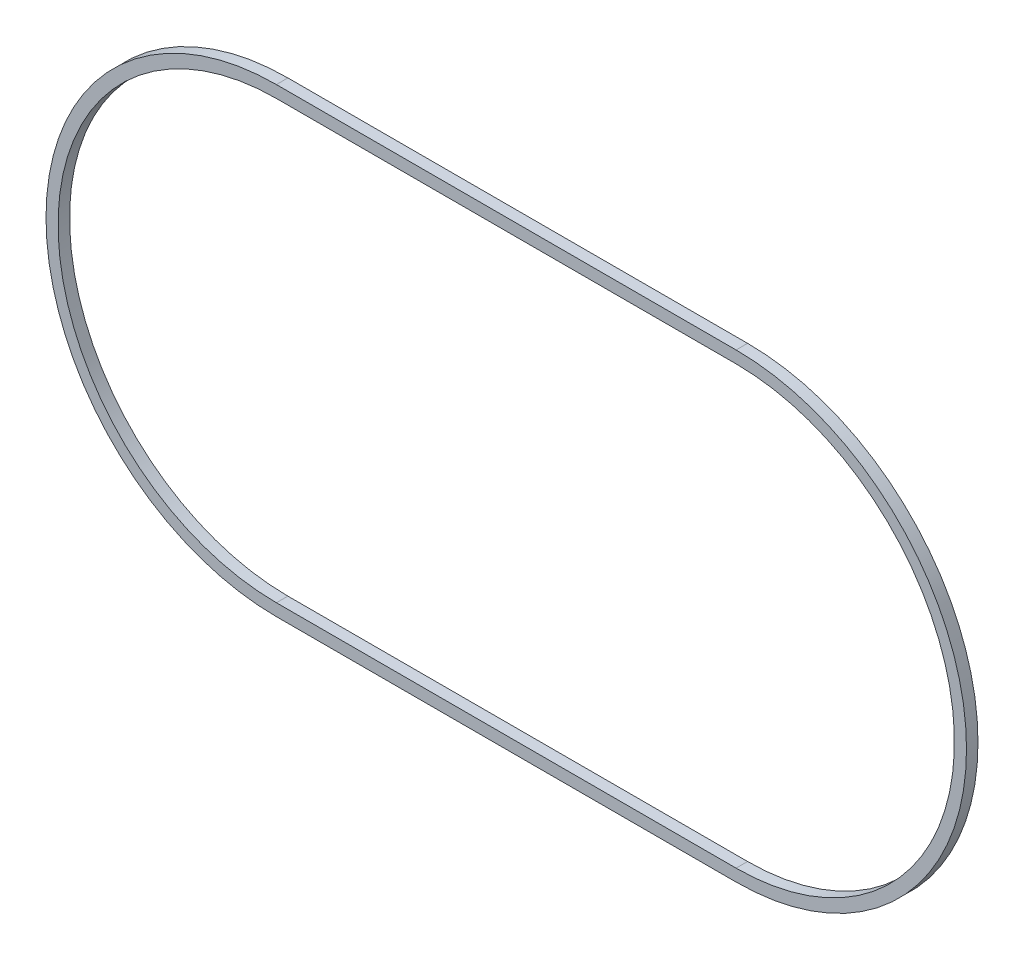
ISO-10303-21;
HEADER;
FILE_DESCRIPTION(('STEP AP214'),'2;1');
FILE_NAME('part.step','',(''),(''),'','','');
FILE_SCHEMA(('AUTOMOTIVE_DESIGN { 1 0 10303 214 1 1 1 1 }'));
ENDSEC;
DATA;
#1=APPLICATION_CONTEXT('core data for automotive mechanical design processes');
#2=APPLICATION_PROTOCOL_DEFINITION('international standard','automotive_design',2000,#1);
#3=PRODUCT_CONTEXT('',#1,'mechanical');
#4=PRODUCT('Part','Part','',(#3));
#5=PRODUCT_RELATED_PRODUCT_CATEGORY('part','',(#4));
#6=PRODUCT_DEFINITION_FORMATION('','',#4);
#7=PRODUCT_DEFINITION_CONTEXT('part definition',#1,'design');
#8=PRODUCT_DEFINITION('design','',#6,#7);
#9=PRODUCT_DEFINITION_SHAPE('','',#8);
#10=(LENGTH_UNIT() NAMED_UNIT(*) SI_UNIT(.MILLI.,.METRE.));
#11=(NAMED_UNIT(*) PLANE_ANGLE_UNIT() SI_UNIT($,.RADIAN.));
#12=(NAMED_UNIT(*) SI_UNIT($,.STERADIAN.) SOLID_ANGLE_UNIT());
#13=UNCERTAINTY_MEASURE_WITH_UNIT(LENGTH_MEASURE(1.E-05),#10,'distance_accuracy_value','');
#14=(GEOMETRIC_REPRESENTATION_CONTEXT(3) GLOBAL_UNCERTAINTY_ASSIGNED_CONTEXT((#13)) GLOBAL_UNIT_ASSIGNED_CONTEXT((#10,
#11,#12)) REPRESENTATION_CONTEXT('',''));
#15=CARTESIAN_POINT('',(0.,0.,0.));
#16=DIRECTION('',(0.,0.,1.));
#17=DIRECTION('',(1.,0.,0.));
#18=AXIS2_PLACEMENT_3D('',#15,#16,#17);
#19=CARTESIAN_POINT('',(-40.,0.,2.));
#20=DIRECTION('',(0.,0.,1.));
#21=DIRECTION('',(1.,0.,0.));
#22=AXIS2_PLACEMENT_3D('',#19,#20,#21);
#23=PLANE('',#22);
#24=CARTESIAN_POINT('',(-40.,0.,2.));
#25=DIRECTION('',(0.,0.,1.));
#26=DIRECTION('',(1.,0.,0.));
#27=AXIS2_PLACEMENT_3D('',#24,#25,#26);
#28=CIRCLE('',#27,40.1);
#29=CARTESIAN_POINT('',(-40.,40.1,2.));
#30=VERTEX_POINT('',#29);
#31=CARTESIAN_POINT('',(-40.,-40.1,2.));
#32=VERTEX_POINT('',#31);
#33=EDGE_CURVE('E140',#30,#32,#28,.T.);
#34=ORIENTED_EDGE('',*,*,#33,.T.);
#35=DIRECTION('',(1.,0.,0.));
#36=VECTOR('',#35,1.);
#37=CARTESIAN_POINT('',(-40.,-40.1,2.));
#38=LINE('',#37,#36);
#39=CARTESIAN_POINT('',(40.,-40.1,2.));
#40=VERTEX_POINT('',#39);
#41=EDGE_CURVE('E143',#32,#40,#38,.T.);
#42=ORIENTED_EDGE('',*,*,#41,.T.);
#43=CARTESIAN_POINT('',(40.,0.,2.));
#44=DIRECTION('',(0.,0.,1.));
#45=DIRECTION('',(1.,0.,0.));
#46=AXIS2_PLACEMENT_3D('',#43,#44,#45);
#47=CIRCLE('',#46,40.1);
#48=CARTESIAN_POINT('',(40.,40.1,2.));
#49=VERTEX_POINT('',#48);
#50=EDGE_CURVE('E146',#40,#49,#47,.T.);
#51=ORIENTED_EDGE('',*,*,#50,.T.);
#52=DIRECTION('',(-1.,0.,0.));
#53=VECTOR('',#52,1.);
#54=CARTESIAN_POINT('',(-40.,40.1,2.));
#55=LINE('',#54,#53);
#56=EDGE_CURVE('E148',#49,#30,#55,.T.);
#57=ORIENTED_EDGE('',*,*,#56,.T.);
#58=EDGE_LOOP('',(#34,#42,#51,#57));
#59=FACE_BOUND('',#58,.T.);
#60=DIRECTION('',(1.,0.,0.));
#61=VECTOR('',#60,1.);
#62=CARTESIAN_POINT('',(-40.,-38.,2.));
#63=LINE('',#62,#61);
#64=CARTESIAN_POINT('',(-40.,-38.,2.));
#65=VERTEX_POINT('',#64);
#66=CARTESIAN_POINT('',(40.,-38.,2.));
#67=VERTEX_POINT('',#66);
#68=EDGE_CURVE('E112',#65,#67,#63,.T.);
#69=ORIENTED_EDGE('',*,*,#68,.F.);
#70=CARTESIAN_POINT('',(-40.,0.,2.));
#71=DIRECTION('',(0.,0.,1.));
#72=DIRECTION('',(1.,0.,0.));
#73=AXIS2_PLACEMENT_3D('',#70,#71,#72);
#74=CIRCLE('',#73,38.);
#75=CARTESIAN_POINT('',(-40.,38.,2.));
#76=VERTEX_POINT('',#75);
#77=EDGE_CURVE('E104',#76,#65,#74,.T.);
#78=ORIENTED_EDGE('',*,*,#77,.F.);
#79=DIRECTION('',(-1.,0.,0.));
#80=VECTOR('',#79,1.);
#81=CARTESIAN_POINT('',(-40.,38.,2.));
#82=LINE('',#81,#80);
#83=CARTESIAN_POINT('',(40.,38.,2.));
#84=VERTEX_POINT('',#83);
#85=EDGE_CURVE('E126',#84,#76,#82,.T.);
#86=ORIENTED_EDGE('',*,*,#85,.F.);
#87=CARTESIAN_POINT('',(40.,0.,2.));
#88=DIRECTION('',(0.,0.,1.));
#89=DIRECTION('',(1.,0.,0.));
#90=AXIS2_PLACEMENT_3D('',#87,#88,#89);
#91=CIRCLE('',#90,38.);
#92=EDGE_CURVE('E124',#67,#84,#91,.T.);
#93=ORIENTED_EDGE('',*,*,#92,.F.);
#94=EDGE_LOOP('',(#69,#78,#86,#93));
#95=FACE_BOUND('',#94,.T.);
#96=ADVANCED_FACE('F39',(#59,#95),#23,.T.);
#97=CARTESIAN_POINT('',(-40.,0.,0.));
#98=DIRECTION('',(0.,0.,1.));
#99=DIRECTION('',(1.,0.,0.));
#100=AXIS2_PLACEMENT_3D('',#97,#98,#99);
#101=PLANE('',#100);
#102=CARTESIAN_POINT('',(-40.,0.,0.));
#103=DIRECTION('',(0.,0.,1.));
#104=DIRECTION('',(1.,0.,0.));
#105=AXIS2_PLACEMENT_3D('',#102,#103,#104);
#106=CIRCLE('',#105,40.1);
#107=CARTESIAN_POINT('',(-40.,40.1,0.));
#108=VERTEX_POINT('',#107);
#109=CARTESIAN_POINT('',(-40.,-40.1,0.));
#110=VERTEX_POINT('',#109);
#111=EDGE_CURVE('E120',#108,#110,#106,.T.);
#112=ORIENTED_EDGE('',*,*,#111,.F.);
#113=DIRECTION('',(-1.,0.,0.));
#114=VECTOR('',#113,1.);
#115=CARTESIAN_POINT('',(-40.,40.1,0.));
#116=LINE('',#115,#114);
#117=CARTESIAN_POINT('',(40.,40.1,0.));
#118=VERTEX_POINT('',#117);
#119=EDGE_CURVE('E144',#118,#108,#116,.T.);
#120=ORIENTED_EDGE('',*,*,#119,.F.);
#121=CARTESIAN_POINT('',(40.,0.,0.));
#122=DIRECTION('',(0.,0.,1.));
#123=DIRECTION('',(1.,0.,0.));
#124=AXIS2_PLACEMENT_3D('',#121,#122,#123);
#125=CIRCLE('',#124,40.1);
#126=CARTESIAN_POINT('',(40.,-40.1,0.));
#127=VERTEX_POINT('',#126);
#128=EDGE_CURVE('E155',#127,#118,#125,.T.);
#129=ORIENTED_EDGE('',*,*,#128,.F.);
#130=DIRECTION('',(1.,0.,0.));
#131=VECTOR('',#130,1.);
#132=CARTESIAN_POINT('',(-40.,-40.1,0.));
#133=LINE('',#132,#131);
#134=EDGE_CURVE('E153',#110,#127,#133,.T.);
#135=ORIENTED_EDGE('',*,*,#134,.F.);
#136=EDGE_LOOP('',(#112,#120,#129,#135));
#137=FACE_BOUND('',#136,.T.);
#138=CARTESIAN_POINT('',(-40.,0.,0.));
#139=DIRECTION('',(0.,0.,1.));
#140=DIRECTION('',(1.,0.,0.));
#141=AXIS2_PLACEMENT_3D('',#138,#139,#140);
#142=CIRCLE('',#141,38.);
#143=CARTESIAN_POINT('',(-40.,38.,0.));
#144=VERTEX_POINT('',#143);
#145=CARTESIAN_POINT('',(-40.,-38.,0.));
#146=VERTEX_POINT('',#145);
#147=EDGE_CURVE('E62',#144,#146,#142,.T.);
#148=ORIENTED_EDGE('',*,*,#147,.T.);
#149=DIRECTION('',(1.,0.,0.));
#150=VECTOR('',#149,1.);
#151=CARTESIAN_POINT('',(-40.,-38.,0.));
#152=LINE('',#151,#150);
#153=CARTESIAN_POINT('',(40.,-38.,0.));
#154=VERTEX_POINT('',#153);
#155=EDGE_CURVE('E119',#146,#154,#152,.T.);
#156=ORIENTED_EDGE('',*,*,#155,.T.);
#157=CARTESIAN_POINT('',(40.,0.,0.));
#158=DIRECTION('',(0.,0.,1.));
#159=DIRECTION('',(1.,0.,0.));
#160=AXIS2_PLACEMENT_3D('',#157,#158,#159);
#161=CIRCLE('',#160,38.);
#162=CARTESIAN_POINT('',(40.,38.,0.));
#163=VERTEX_POINT('',#162);
#164=EDGE_CURVE('E132',#154,#163,#161,.T.);
#165=ORIENTED_EDGE('',*,*,#164,.T.);
#166=DIRECTION('',(-1.,0.,0.));
#167=VECTOR('',#166,1.);
#168=CARTESIAN_POINT('',(-40.,38.,0.));
#169=LINE('',#168,#167);
#170=EDGE_CURVE('E113',#163,#144,#169,.T.);
#171=ORIENTED_EDGE('',*,*,#170,.T.);
#172=EDGE_LOOP('',(#148,#156,#165,#171));
#173=FACE_BOUND('',#172,.T.);
#174=ADVANCED_FACE('F173',(#137,#173),#101,.F.);
#175=CARTESIAN_POINT('',(-40.,0.,2.));
#176=DIRECTION('',(0.,0.,-1.));
#177=DIRECTION('',(-1.,0.,0.));
#178=AXIS2_PLACEMENT_3D('',#175,#176,#177);
#179=CYLINDRICAL_SURFACE('',#178,40.1);
#180=ORIENTED_EDGE('',*,*,#111,.T.);
#181=DIRECTION('',(0.,0.,-1.));
#182=VECTOR('',#181,1.);
#183=CARTESIAN_POINT('',(-40.,-40.1,2.));
#184=LINE('',#183,#182);
#185=EDGE_CURVE('E11',#32,#110,#184,.T.);
#186=ORIENTED_EDGE('',*,*,#185,.F.);
#187=ORIENTED_EDGE('',*,*,#33,.F.);
#188=DIRECTION('',(0.,0.,-1.));
#189=VECTOR('',#188,1.);
#190=CARTESIAN_POINT('',(-40.,40.1,2.));
#191=LINE('',#190,#189);
#192=EDGE_CURVE('E150',#30,#108,#191,.T.);
#193=ORIENTED_EDGE('',*,*,#192,.T.);
#194=EDGE_LOOP('',(#180,#186,#187,#193));
#195=FACE_BOUND('',#194,.T.);
#196=ADVANCED_FACE('F41',(#195),#179,.T.);
#197=CARTESIAN_POINT('',(-40.,-40.1,2.));
#198=DIRECTION('',(0.,1.,0.));
#199=DIRECTION('',(-1.,0.,0.));
#200=AXIS2_PLACEMENT_3D('',#197,#198,#199);
#201=PLANE('',#200);
#202=ORIENTED_EDGE('',*,*,#134,.T.);
#203=DIRECTION('',(0.,0.,-1.));
#204=VECTOR('',#203,1.);
#205=CARTESIAN_POINT('',(40.,-40.1,2.));
#206=LINE('',#205,#204);
#207=EDGE_CURVE('E47',#40,#127,#206,.T.);
#208=ORIENTED_EDGE('',*,*,#207,.F.);
#209=ORIENTED_EDGE('',*,*,#41,.F.);
#210=ORIENTED_EDGE('',*,*,#185,.T.);
#211=EDGE_LOOP('',(#202,#208,#209,#210));
#212=FACE_BOUND('',#211,.T.);
#213=ADVANCED_FACE('F183',(#212),#201,.F.);
#214=CARTESIAN_POINT('',(40.,0.,2.));
#215=DIRECTION('',(0.,0.,-1.));
#216=DIRECTION('',(-1.,0.,0.));
#217=AXIS2_PLACEMENT_3D('',#214,#215,#216);
#218=CYLINDRICAL_SURFACE('',#217,40.1);
#219=ORIENTED_EDGE('',*,*,#128,.T.);
#220=DIRECTION('',(0.,0.,-1.));
#221=VECTOR('',#220,1.);
#222=CARTESIAN_POINT('',(40.,40.1,2.));
#223=LINE('',#222,#221);
#224=EDGE_CURVE('E160',#49,#118,#223,.T.);
#225=ORIENTED_EDGE('',*,*,#224,.F.);
#226=ORIENTED_EDGE('',*,*,#50,.F.);
#227=ORIENTED_EDGE('',*,*,#207,.T.);
#228=EDGE_LOOP('',(#219,#225,#226,#227));
#229=FACE_BOUND('',#228,.T.);
#230=ADVANCED_FACE('F167',(#229),#218,.T.);
#231=CARTESIAN_POINT('',(-40.,40.1,2.));
#232=DIRECTION('',(0.,-1.,0.));
#233=DIRECTION('',(0.,0.,-1.));
#234=AXIS2_PLACEMENT_3D('',#231,#232,#233);
#235=PLANE('',#234);
#236=ORIENTED_EDGE('',*,*,#119,.T.);
#237=ORIENTED_EDGE('',*,*,#192,.F.);
#238=ORIENTED_EDGE('',*,*,#56,.F.);
#239=ORIENTED_EDGE('',*,*,#224,.T.);
#240=EDGE_LOOP('',(#236,#237,#238,#239));
#241=FACE_BOUND('',#240,.T.);
#242=ADVANCED_FACE('F177',(#241),#235,.F.);
#243=CARTESIAN_POINT('',(-40.,0.,2.));
#244=DIRECTION('',(0.,0.,-1.));
#245=DIRECTION('',(-1.,0.,0.));
#246=AXIS2_PLACEMENT_3D('',#243,#244,#245);
#247=CYLINDRICAL_SURFACE('',#246,38.);
#248=ORIENTED_EDGE('',*,*,#147,.F.);
#249=DIRECTION('',(0.,0.,-1.));
#250=VECTOR('',#249,1.);
#251=CARTESIAN_POINT('',(-40.,38.,2.));
#252=LINE('',#251,#250);
#253=EDGE_CURVE('E108',#76,#144,#252,.T.);
#254=ORIENTED_EDGE('',*,*,#253,.F.);
#255=ORIENTED_EDGE('',*,*,#77,.T.);
#256=DIRECTION('',(0.,0.,-1.));
#257=VECTOR('',#256,1.);
#258=CARTESIAN_POINT('',(-40.,-38.,2.));
#259=LINE('',#258,#257);
#260=EDGE_CURVE('E107',#65,#146,#259,.T.);
#261=ORIENTED_EDGE('',*,*,#260,.T.);
#262=EDGE_LOOP('',(#248,#254,#255,#261));
#263=FACE_BOUND('',#262,.T.);
#264=ADVANCED_FACE('F106',(#263),#247,.F.);
#265=CARTESIAN_POINT('',(-40.,-38.,2.));
#266=DIRECTION('',(0.,1.,0.));
#267=DIRECTION('',(0.,0.,1.));
#268=AXIS2_PLACEMENT_3D('',#265,#266,#267);
#269=PLANE('',#268);
#270=ORIENTED_EDGE('',*,*,#155,.F.);
#271=ORIENTED_EDGE('',*,*,#260,.F.);
#272=ORIENTED_EDGE('',*,*,#68,.T.);
#273=DIRECTION('',(0.,0.,-1.));
#274=VECTOR('',#273,1.);
#275=CARTESIAN_POINT('',(40.,-38.,2.));
#276=LINE('',#275,#274);
#277=EDGE_CURVE('E121',#67,#154,#276,.T.);
#278=ORIENTED_EDGE('',*,*,#277,.T.);
#279=EDGE_LOOP('',(#270,#271,#272,#278));
#280=FACE_BOUND('',#279,.T.);
#281=ADVANCED_FACE('F116',(#280),#269,.T.);
#282=CARTESIAN_POINT('',(40.,0.,2.));
#283=DIRECTION('',(0.,0.,-1.));
#284=DIRECTION('',(-1.,0.,0.));
#285=AXIS2_PLACEMENT_3D('',#282,#283,#284);
#286=CYLINDRICAL_SURFACE('',#285,38.);
#287=ORIENTED_EDGE('',*,*,#164,.F.);
#288=ORIENTED_EDGE('',*,*,#277,.F.);
#289=ORIENTED_EDGE('',*,*,#92,.T.);
#290=DIRECTION('',(0.,0.,-1.));
#291=VECTOR('',#290,1.);
#292=CARTESIAN_POINT('',(40.,38.,2.));
#293=LINE('',#292,#291);
#294=EDGE_CURVE('E54',#84,#163,#293,.T.);
#295=ORIENTED_EDGE('',*,*,#294,.T.);
#296=EDGE_LOOP('',(#287,#288,#289,#295));
#297=FACE_BOUND('',#296,.T.);
#298=ADVANCED_FACE('F206',(#297),#286,.F.);
#299=CARTESIAN_POINT('',(-40.,38.,2.));
#300=DIRECTION('',(0.,-1.,0.));
#301=DIRECTION('',(0.,0.,-1.));
#302=AXIS2_PLACEMENT_3D('',#299,#300,#301);
#303=PLANE('',#302);
#304=ORIENTED_EDGE('',*,*,#170,.F.);
#305=ORIENTED_EDGE('',*,*,#294,.F.);
#306=ORIENTED_EDGE('',*,*,#85,.T.);
#307=ORIENTED_EDGE('',*,*,#253,.T.);
#308=EDGE_LOOP('',(#304,#305,#306,#307));
#309=FACE_BOUND('',#308,.T.);
#310=ADVANCED_FACE('F210',(#309),#303,.T.);
#311=CLOSED_SHELL('',(#96,#174,#196,#213,#230,#242,#264,#281,#298,#310));
#312=MANIFOLD_SOLID_BREP('B2',#311);
#313=ADVANCED_BREP_SHAPE_REPRESENTATION('',(#18,#312),#14);
#314=SHAPE_DEFINITION_REPRESENTATION(#9,#313);
ENDSEC;
END-ISO-10303-21;
